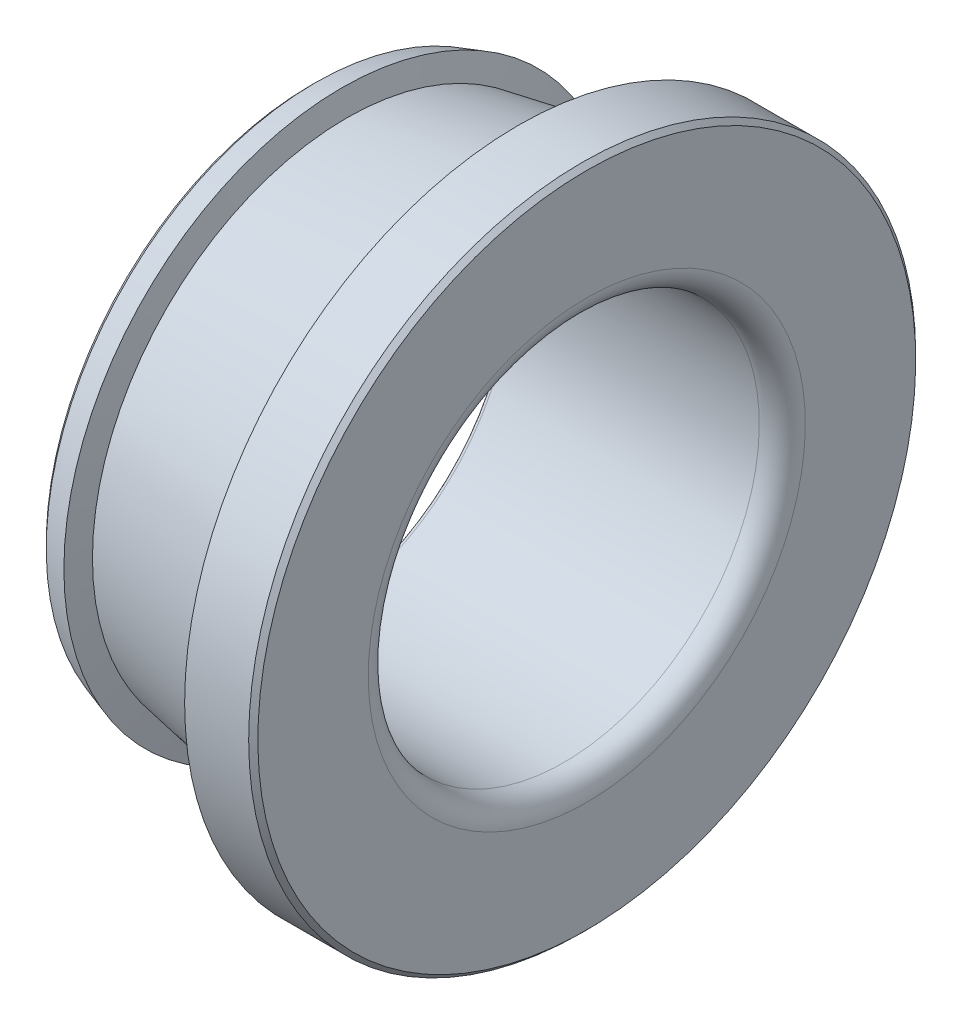
ISO-10303-21;
HEADER;
FILE_DESCRIPTION(('STEP AP214'),'2;1');
FILE_NAME('part.step','',(''),(''),'','','');
FILE_SCHEMA(('AUTOMOTIVE_DESIGN { 1 0 10303 214 1 1 1 1 }'));
ENDSEC;
DATA;
#1=APPLICATION_CONTEXT('core data for automotive mechanical design processes');
#2=APPLICATION_PROTOCOL_DEFINITION('international standard','automotive_design',2000,#1);
#3=PRODUCT_CONTEXT('',#1,'mechanical');
#4=PRODUCT('Part','Part','',(#3));
#5=PRODUCT_RELATED_PRODUCT_CATEGORY('part','',(#4));
#6=PRODUCT_DEFINITION_FORMATION('','',#4);
#7=PRODUCT_DEFINITION_CONTEXT('part definition',#1,'design');
#8=PRODUCT_DEFINITION('design','',#6,#7);
#9=PRODUCT_DEFINITION_SHAPE('','',#8);
#10=(LENGTH_UNIT() NAMED_UNIT(*) SI_UNIT(.MILLI.,.METRE.));
#11=(NAMED_UNIT(*) PLANE_ANGLE_UNIT() SI_UNIT($,.RADIAN.));
#12=(NAMED_UNIT(*) SI_UNIT($,.STERADIAN.) SOLID_ANGLE_UNIT());
#13=UNCERTAINTY_MEASURE_WITH_UNIT(LENGTH_MEASURE(1.E-05),#10,'distance_accuracy_value','');
#14=(GEOMETRIC_REPRESENTATION_CONTEXT(3) GLOBAL_UNCERTAINTY_ASSIGNED_CONTEXT((#13)) GLOBAL_UNIT_ASSIGNED_CONTEXT((#10,
#11,#12)) REPRESENTATION_CONTEXT('',''));
#15=CARTESIAN_POINT('',(0.,0.,0.));
#16=DIRECTION('',(0.,0.,1.));
#17=DIRECTION('',(1.,0.,0.));
#18=AXIS2_PLACEMENT_3D('',#15,#16,#17);
#19=CARTESIAN_POINT('',(5.675,0.,0.));
#20=DIRECTION('',(1.,0.,0.));
#21=DIRECTION('',(0.,1.,0.));
#22=AXIS2_PLACEMENT_3D('',#19,#20,#21);
#23=CONICAL_SURFACE('',#22,13.1,0.319974357330257);
#24=CARTESIAN_POINT('',(1.45,0.,0.));
#25=DIRECTION('',(1.,0.,0.));
#26=DIRECTION('',(0.,1.,0.));
#27=AXIS2_PLACEMENT_3D('',#24,#25,#26);
#28=CIRCLE('',#27,11.7);
#29=CARTESIAN_POINT('',(1.45,11.7,0.));
#30=VERTEX_POINT('',#29);
#31=EDGE_CURVE('E11',#30,#30,#28,.T.);
#32=ORIENTED_EDGE('',*,*,#31,.T.);
#33=EDGE_LOOP('',(#32));
#34=FACE_BOUND('',#33,.T.);
#35=CARTESIAN_POINT('',(2.5967835036903,0.,0.));
#36=DIRECTION('',(-1.,0.,0.));
#37=DIRECTION('',(0.,1.,0.));
#38=AXIS2_PLACEMENT_3D('',#35,#36,#37);
#39=CIRCLE('',#38,12.079999267495);
#40=CARTESIAN_POINT('',(2.5967835036903,-12.079999267495,0.));
#41=VERTEX_POINT('',#40);
#42=EDGE_CURVE('E64',#41,#41,#39,.T.);
#43=ORIENTED_EDGE('',*,*,#42,.T.);
#44=EDGE_LOOP('',(#43));
#45=FACE_BOUND('',#44,.T.);
#46=ADVANCED_FACE('F16',(#34,#45),#23,.T.);
#47=CARTESIAN_POINT('',(1.35,0.,0.));
#48=DIRECTION('',(1.,0.,0.));
#49=DIRECTION('',(0.,1.,0.));
#50=AXIS2_PLACEMENT_3D('',#47,#48,#49);
#51=CONICAL_SURFACE('',#50,11.6,0.785398163397446);
#52=CARTESIAN_POINT('',(1.25,0.,0.));
#53=DIRECTION('',(1.,0.,0.));
#54=DIRECTION('',(0.,1.,0.));
#55=AXIS2_PLACEMENT_3D('',#52,#53,#54);
#56=CIRCLE('',#55,11.5);
#57=CARTESIAN_POINT('',(1.25,11.5,0.));
#58=VERTEX_POINT('',#57);
#59=EDGE_CURVE('E19',#58,#58,#56,.T.);
#60=ORIENTED_EDGE('',*,*,#59,.T.);
#61=EDGE_LOOP('',(#60));
#62=FACE_BOUND('',#61,.T.);
#63=ORIENTED_EDGE('',*,*,#31,.F.);
#64=EDGE_LOOP('',(#63));
#65=FACE_BOUND('',#64,.T.);
#66=ADVANCED_FACE('F107',(#62,#65),#51,.T.);
#67=CARTESIAN_POINT('',(1.25,10.1,0.));
#68=DIRECTION('',(-1.,0.,0.));
#69=DIRECTION('',(0.,-1.,0.));
#70=AXIS2_PLACEMENT_3D('',#67,#68,#69);
#71=PLANE('',#70);
#72=CARTESIAN_POINT('',(1.25,0.,0.));
#73=DIRECTION('',(1.,0.,0.));
#74=DIRECTION('',(0.,1.,0.));
#75=AXIS2_PLACEMENT_3D('',#72,#73,#74);
#76=CIRCLE('',#75,8.7);
#77=CARTESIAN_POINT('',(1.25,8.7,0.));
#78=VERTEX_POINT('',#77);
#79=EDGE_CURVE('E48',#78,#78,#76,.T.);
#80=ORIENTED_EDGE('',*,*,#79,.T.);
#81=EDGE_LOOP('',(#80));
#82=FACE_BOUND('',#81,.T.);
#83=ORIENTED_EDGE('',*,*,#59,.F.);
#84=EDGE_LOOP('',(#83));
#85=FACE_BOUND('',#84,.T.);
#86=ADVANCED_FACE('F111',(#82,#85),#71,.T.);
#87=CARTESIAN_POINT('',(1.45,0.,0.));
#88=DIRECTION('',(1.,0.,0.));
#89=DIRECTION('',(0.,0.,-1.));
#90=AXIS2_PLACEMENT_3D('',#87,#88,#89);
#91=TOROIDAL_SURFACE('',#90,8.7,0.2);
#92=CARTESIAN_POINT('',(1.45,0.,0.));
#93=DIRECTION('',(1.,0.,0.));
#94=DIRECTION('',(0.,1.,0.));
#95=AXIS2_PLACEMENT_3D('',#92,#93,#94);
#96=CIRCLE('',#95,8.5);
#97=CARTESIAN_POINT('',(1.45,8.5,0.));
#98=VERTEX_POINT('',#97);
#99=EDGE_CURVE('E53',#98,#98,#96,.T.);
#100=ORIENTED_EDGE('',*,*,#99,.T.);
#101=EDGE_LOOP('',(#100));
#102=FACE_BOUND('',#101,.T.);
#103=ORIENTED_EDGE('',*,*,#79,.F.);
#104=EDGE_LOOP('',(#103));
#105=FACE_BOUND('',#104,.T.);
#106=ADVANCED_FACE('F116',(#102,#105),#91,.T.);
#107=CARTESIAN_POINT('',(6.85,0.,0.));
#108=DIRECTION('',(-1.,0.,0.));
#109=DIRECTION('',(0.,1.,0.));
#110=AXIS2_PLACEMENT_3D('',#107,#108,#109);
#111=CYLINDRICAL_SURFACE('',#110,8.5);
#112=CARTESIAN_POINT('',(12.25,0.,0.));
#113=DIRECTION('',(1.,0.,0.));
#114=DIRECTION('',(0.,1.,0.));
#115=AXIS2_PLACEMENT_3D('',#112,#113,#114);
#116=CIRCLE('',#115,8.5);
#117=CARTESIAN_POINT('',(12.25,8.5,0.));
#118=VERTEX_POINT('',#117);
#119=EDGE_CURVE('E81',#118,#118,#116,.T.);
#120=ORIENTED_EDGE('',*,*,#119,.T.);
#121=EDGE_LOOP('',(#120));
#122=FACE_BOUND('',#121,.T.);
#123=ORIENTED_EDGE('',*,*,#99,.F.);
#124=EDGE_LOOP('',(#123));
#125=FACE_BOUND('',#124,.T.);
#126=ADVANCED_FACE('F122',(#122,#125),#111,.F.);
#127=CARTESIAN_POINT('',(12.25,0.,0.));
#128=DIRECTION('',(1.,0.,0.));
#129=DIRECTION('',(0.,0.,-1.));
#130=AXIS2_PLACEMENT_3D('',#127,#128,#129);
#131=TOROIDAL_SURFACE('',#130,9.5,1.);
#132=CARTESIAN_POINT('',(13.25,0.,0.));
#133=DIRECTION('',(1.,0.,0.));
#134=DIRECTION('',(0.,1.,0.));
#135=AXIS2_PLACEMENT_3D('',#132,#133,#134);
#136=CIRCLE('',#135,9.5);
#137=CARTESIAN_POINT('',(13.25,9.5,0.));
#138=VERTEX_POINT('',#137);
#139=EDGE_CURVE('E79',#138,#138,#136,.T.);
#140=ORIENTED_EDGE('',*,*,#139,.T.);
#141=EDGE_LOOP('',(#140));
#142=FACE_BOUND('',#141,.T.);
#143=ORIENTED_EDGE('',*,*,#119,.F.);
#144=EDGE_LOOP('',(#143));
#145=FACE_BOUND('',#144,.T.);
#146=ADVANCED_FACE('F125',(#142,#145),#131,.T.);
#147=CARTESIAN_POINT('',(13.25,11.9,0.));
#148=DIRECTION('',(1.,0.,0.));
#149=DIRECTION('',(0.,1.,0.));
#150=AXIS2_PLACEMENT_3D('',#147,#148,#149);
#151=PLANE('',#150);
#152=CARTESIAN_POINT('',(13.25,0.,0.));
#153=DIRECTION('',(1.,0.,0.));
#154=DIRECTION('',(0.,1.,0.));
#155=AXIS2_PLACEMENT_3D('',#152,#153,#154);
#156=CIRCLE('',#155,14.3);
#157=CARTESIAN_POINT('',(13.25,14.3,0.));
#158=VERTEX_POINT('',#157);
#159=EDGE_CURVE('E73',#158,#158,#156,.T.);
#160=ORIENTED_EDGE('',*,*,#159,.T.);
#161=EDGE_LOOP('',(#160));
#162=FACE_BOUND('',#161,.T.);
#163=ORIENTED_EDGE('',*,*,#139,.F.);
#164=EDGE_LOOP('',(#163));
#165=FACE_BOUND('',#164,.T.);
#166=ADVANCED_FACE('F129',(#162,#165),#151,.T.);
#167=CARTESIAN_POINT('',(13.15,0.,0.));
#168=DIRECTION('',(-1.,0.,0.));
#169=DIRECTION('',(0.,1.,0.));
#170=AXIS2_PLACEMENT_3D('',#167,#168,#169);
#171=CONICAL_SURFACE('',#170,14.4,0.785398163397448);
#172=CARTESIAN_POINT('',(13.05,0.,0.));
#173=DIRECTION('',(1.,0.,0.));
#174=DIRECTION('',(0.,1.,0.));
#175=AXIS2_PLACEMENT_3D('',#172,#173,#174);
#176=CIRCLE('',#175,14.5);
#177=CARTESIAN_POINT('',(13.05,14.5,0.));
#178=VERTEX_POINT('',#177);
#179=EDGE_CURVE('E71',#178,#178,#176,.T.);
#180=ORIENTED_EDGE('',*,*,#179,.T.);
#181=EDGE_LOOP('',(#180));
#182=FACE_BOUND('',#181,.T.);
#183=ORIENTED_EDGE('',*,*,#159,.F.);
#184=EDGE_LOOP('',(#183));
#185=FACE_BOUND('',#184,.T.);
#186=ADVANCED_FACE('F133',(#182,#185),#171,.T.);
#187=CARTESIAN_POINT('',(11.475,0.,0.));
#188=DIRECTION('',(-1.,0.,0.));
#189=DIRECTION('',(0.,1.,0.));
#190=AXIS2_PLACEMENT_3D('',#187,#188,#189);
#191=CYLINDRICAL_SURFACE('',#190,14.5);
#192=ORIENTED_EDGE('',*,*,#179,.F.);
#193=EDGE_LOOP('',(#192));
#194=FACE_BOUND('',#193,.T.);
#195=CARTESIAN_POINT('',(10.2659860816963,0.,0.));
#196=DIRECTION('',(1.,0.,0.));
#197=DIRECTION('',(0.,1.,0.));
#198=AXIS2_PLACEMENT_3D('',#195,#196,#197);
#199=CIRCLE('',#198,14.5);
#200=CARTESIAN_POINT('',(10.2659860816963,-14.5,0.));
#201=VERTEX_POINT('',#200);
#202=EDGE_CURVE('E68',#201,#201,#199,.T.);
#203=ORIENTED_EDGE('',*,*,#202,.T.);
#204=EDGE_LOOP('',(#203));
#205=FACE_BOUND('',#204,.T.);
#206=ADVANCED_FACE('F69',(#194,#205),#191,.T.);
#207=CARTESIAN_POINT('',(10.1149066065488,0.,0.));
#208=DIRECTION('',(-1.,0.,0.));
#209=DIRECTION('',(0.,1.,0.));
#210=AXIS2_PLACEMENT_3D('',#207,#208,#209);
#211=CONICAL_SURFACE('',#210,15.232257220594,1.36733107858515);
#212=CARTESIAN_POINT('',(10.6806866609646,0.,0.));
#213=DIRECTION('',(1.,0.,0.));
#214=DIRECTION('',(0.,1.,0.));
#215=AXIS2_PLACEMENT_3D('',#212,#213,#214);
#216=CIRCLE('',#215,12.4900149027042);
#217=CARTESIAN_POINT('',(10.6806866609646,12.4900149027042,0.));
#218=VERTEX_POINT('',#217);
#219=EDGE_CURVE('E75',#218,#218,#216,.T.);
#220=ORIENTED_EDGE('',*,*,#219,.T.);
#221=EDGE_LOOP('',(#220));
#222=FACE_BOUND('',#221,.T.);
#223=ORIENTED_EDGE('',*,*,#202,.F.);
#224=EDGE_LOOP('',(#223));
#225=FACE_BOUND('',#224,.T.);
#226=ADVANCED_FACE('F96',(#222,#225),#211,.F.);
#227=CARTESIAN_POINT('',(2.27992855543528,0.,0.));
#228=DIRECTION('',(-1.,0.,0.));
#229=DIRECTION('',(0.,1.,0.));
#230=AXIS2_PLACEMENT_3D('',#227,#228,#229);
#231=CONICAL_SURFACE('',#230,13.615742779406,1.36733107858515);
#232=CARTESIAN_POINT('',(2.80915743690772,0.,0.));
#233=DIRECTION('',(1.,0.,0.));
#234=DIRECTION('',(0.,1.,0.));
#235=AXIS2_PLACEMENT_3D('',#232,#233,#234);
#236=CIRCLE('',#235,11.0506579495391);
#237=CARTESIAN_POINT('',(2.80915743690772,11.0506579495391,0.));
#238=VERTEX_POINT('',#237);
#239=EDGE_CURVE('E84',#238,#238,#236,.T.);
#240=ORIENTED_EDGE('',*,*,#239,.F.);
#241=EDGE_LOOP('',(#240));
#242=FACE_BOUND('',#241,.T.);
#243=ORIENTED_EDGE('',*,*,#42,.F.);
#244=EDGE_LOOP('',(#243));
#245=FACE_BOUND('',#244,.T.);
#246=ADVANCED_FACE('F93',(#242,#245),#231,.T.);
#247=CARTESIAN_POINT('',(6.74492204893616,0.,0.));
#248=DIRECTION('',(1.,0.,0.));
#249=DIRECTION('',(0.,1.,0.));
#250=AXIS2_PLACEMENT_3D('',#247,#248,#249);
#251=CONICAL_SURFACE('',#250,11.7703364261217,0.18085799840866);
#252=ORIENTED_EDGE('',*,*,#219,.F.);
#253=EDGE_LOOP('',(#252));
#254=FACE_BOUND('',#253,.T.);
#255=ORIENTED_EDGE('',*,*,#239,.T.);
#256=EDGE_LOOP('',(#255));
#257=FACE_BOUND('',#256,.T.);
#258=ADVANCED_FACE('F91',(#254,#257),#251,.T.);
#259=CLOSED_SHELL('',(#46,#66,#86,#106,#126,#146,#166,#186,#206,#226,#246,#258));
#260=MANIFOLD_SOLID_BREP('B1',#259);
#261=ADVANCED_BREP_SHAPE_REPRESENTATION('',(#18,#260),#14);
#262=SHAPE_DEFINITION_REPRESENTATION(#9,#261);
ENDSEC;
END-ISO-10303-21;
